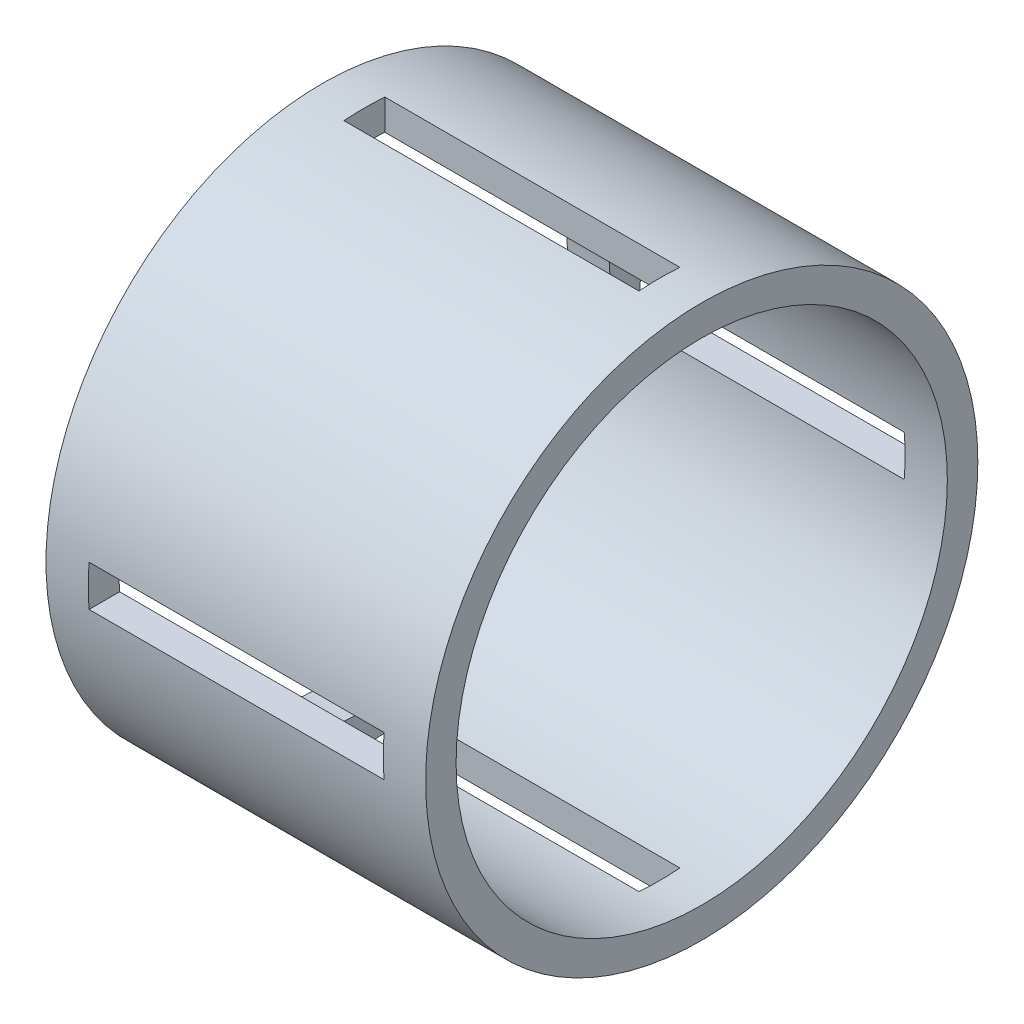
ISO-10303-21;
HEADER;
FILE_DESCRIPTION(('STEP AP214'),'2;1');
FILE_NAME('part.step','',(''),(''),'','','');
FILE_SCHEMA(('AUTOMOTIVE_DESIGN { 1 0 10303 214 1 1 1 1 }'));
ENDSEC;
DATA;
#1=APPLICATION_CONTEXT('core data for automotive mechanical design processes');
#2=APPLICATION_PROTOCOL_DEFINITION('international standard','automotive_design',2000,#1);
#3=PRODUCT_CONTEXT('',#1,'mechanical');
#4=PRODUCT('Part','Part','',(#3));
#5=PRODUCT_RELATED_PRODUCT_CATEGORY('part','',(#4));
#6=PRODUCT_DEFINITION_FORMATION('','',#4);
#7=PRODUCT_DEFINITION_CONTEXT('part definition',#1,'design');
#8=PRODUCT_DEFINITION('design','',#6,#7);
#9=PRODUCT_DEFINITION_SHAPE('','',#8);
#10=(LENGTH_UNIT() NAMED_UNIT(*) SI_UNIT(.MILLI.,.METRE.));
#11=(NAMED_UNIT(*) PLANE_ANGLE_UNIT() SI_UNIT($,.RADIAN.));
#12=(NAMED_UNIT(*) SI_UNIT($,.STERADIAN.) SOLID_ANGLE_UNIT());
#13=UNCERTAINTY_MEASURE_WITH_UNIT(LENGTH_MEASURE(1.E-05),#10,'distance_accuracy_value','');
#14=(GEOMETRIC_REPRESENTATION_CONTEXT(3) GLOBAL_UNCERTAINTY_ASSIGNED_CONTEXT((#13)) GLOBAL_UNIT_ASSIGNED_CONTEXT((#10,
#11,#12)) REPRESENTATION_CONTEXT('',''));
#15=CARTESIAN_POINT('',(0.,0.,0.));
#16=DIRECTION('',(0.,0.,1.));
#17=DIRECTION('',(1.,0.,0.));
#18=AXIS2_PLACEMENT_3D('',#15,#16,#17);
#19=CARTESIAN_POINT('',(6.5,0.68,8.68));
#20=DIRECTION('',(0.,-1.,0.));
#21=DIRECTION('',(1.,0.,0.));
#22=AXIS2_PLACEMENT_3D('',#19,#20,#21);
#23=PLANE('',#22);
#24=DIRECTION('',(1.,0.,0.));
#25=VECTOR('',#24,1.);
#26=CARTESIAN_POINT('',(6.5,0.68,8.13161730530895));
#27=LINE('',#26,#25);
#28=CARTESIAN_POINT('',(11.4,0.68,8.13161730530895));
#29=VERTEX_POINT('',#28);
#30=CARTESIAN_POINT('',(1.6,0.68,8.13161730530895));
#31=VERTEX_POINT('',#30);
#32=EDGE_CURVE('E154',#29,#31,#27,.F.);
#33=ORIENTED_EDGE('',*,*,#32,.F.);
#34=DIRECTION('',(0.,0.,1.));
#35=VECTOR('',#34,1.);
#36=CARTESIAN_POINT('',(11.4,0.68,8.68));
#37=LINE('',#36,#35);
#38=CARTESIAN_POINT('',(11.4,0.68,9.147560321747));
#39=VERTEX_POINT('',#38);
#40=EDGE_CURVE('E237',#29,#39,#37,.T.);
#41=ORIENTED_EDGE('',*,*,#40,.T.);
#42=DIRECTION('',(1.,0.,0.));
#43=VECTOR('',#42,1.);
#44=CARTESIAN_POINT('',(6.5,0.680000000000001,9.147560321747));
#45=LINE('',#44,#43);
#46=CARTESIAN_POINT('',(1.6,0.680000000000001,9.147560321747));
#47=VERTEX_POINT('',#46);
#48=EDGE_CURVE('E219',#47,#39,#45,.T.);
#49=ORIENTED_EDGE('',*,*,#48,.F.);
#50=DIRECTION('',(0.,0.,1.));
#51=VECTOR('',#50,1.);
#52=CARTESIAN_POINT('',(1.6,0.680000000000001,8.68));
#53=LINE('',#52,#51);
#54=EDGE_CURVE('E242',#47,#31,#53,.F.);
#55=ORIENTED_EDGE('',*,*,#54,.T.);
#56=EDGE_LOOP('',(#33,#41,#49,#55));
#57=FACE_BOUND('',#56,.T.);
#58=ADVANCED_FACE('F16',(#57),#23,.T.);
#59=CARTESIAN_POINT('',(6.5,0.68,-8.68));
#60=DIRECTION('',(0.,-1.,0.));
#61=DIRECTION('',(0.,0.,-1.));
#62=AXIS2_PLACEMENT_3D('',#59,#60,#61);
#63=PLANE('',#62);
#64=DIRECTION('',(1.,0.,0.));
#65=VECTOR('',#64,1.);
#66=CARTESIAN_POINT('',(6.5,0.680000000000001,-8.13161730530895));
#67=LINE('',#66,#65);
#68=CARTESIAN_POINT('',(1.6,0.68,-8.13161730530895));
#69=VERTEX_POINT('',#68);
#70=CARTESIAN_POINT('',(11.4,0.68,-8.13161730530895));
#71=VERTEX_POINT('',#70);
#72=EDGE_CURVE('E151',#69,#71,#67,.T.);
#73=ORIENTED_EDGE('',*,*,#72,.F.);
#74=DIRECTION('',(0.,0.,-1.));
#75=VECTOR('',#74,1.);
#76=CARTESIAN_POINT('',(1.6,0.68,-8.68));
#77=LINE('',#76,#75);
#78=CARTESIAN_POINT('',(1.6,0.68,-9.147560321747));
#79=VERTEX_POINT('',#78);
#80=EDGE_CURVE('E232',#69,#79,#77,.T.);
#81=ORIENTED_EDGE('',*,*,#80,.T.);
#82=DIRECTION('',(1.,0.,0.));
#83=VECTOR('',#82,1.);
#84=CARTESIAN_POINT('',(6.5,0.68,-9.147560321747));
#85=LINE('',#84,#83);
#86=CARTESIAN_POINT('',(11.4,0.68,-9.147560321747));
#87=VERTEX_POINT('',#86);
#88=EDGE_CURVE('E214',#87,#79,#85,.F.);
#89=ORIENTED_EDGE('',*,*,#88,.F.);
#90=DIRECTION('',(0.,0.,-1.));
#91=VECTOR('',#90,1.);
#92=CARTESIAN_POINT('',(11.4,0.68,-8.68));
#93=LINE('',#92,#91);
#94=EDGE_CURVE('E234',#87,#71,#93,.F.);
#95=ORIENTED_EDGE('',*,*,#94,.T.);
#96=EDGE_LOOP('',(#73,#81,#89,#95));
#97=FACE_BOUND('',#96,.T.);
#98=ADVANCED_FACE('F297',(#97),#63,.T.);
#99=CARTESIAN_POINT('',(1.6,8.68,0.));
#100=DIRECTION('',(1.,0.,0.));
#101=DIRECTION('',(0.,1.,0.));
#102=AXIS2_PLACEMENT_3D('',#99,#100,#101);
#103=PLANE('',#102);
#104=CARTESIAN_POINT('',(1.6,0.,0.));
#105=DIRECTION('',(1.,0.,0.));
#106=DIRECTION('',(0.,0.,-1.));
#107=AXIS2_PLACEMENT_3D('',#104,#105,#106);
#108=CIRCLE('',#107,8.16);
#109=CARTESIAN_POINT('',(1.6,8.13161730530895,-0.68));
#110=VERTEX_POINT('',#109);
#111=CARTESIAN_POINT('',(1.6,8.13161730530895,0.68));
#112=VERTEX_POINT('',#111);
#113=EDGE_CURVE('E19',#110,#112,#108,.T.);
#114=ORIENTED_EDGE('',*,*,#113,.F.);
#115=DIRECTION('',(0.,-1.,0.));
#116=VECTOR('',#115,1.);
#117=CARTESIAN_POINT('',(1.6,8.68,-0.68));
#118=LINE('',#117,#116);
#119=CARTESIAN_POINT('',(1.6,9.147560321747,-0.68));
#120=VERTEX_POINT('',#119);
#121=EDGE_CURVE('E228',#120,#110,#118,.T.);
#122=ORIENTED_EDGE('',*,*,#121,.F.);
#123=CARTESIAN_POINT('',(1.6,0.,0.));
#124=DIRECTION('',(1.,0.,0.));
#125=DIRECTION('',(0.,0.,-1.));
#126=AXIS2_PLACEMENT_3D('',#123,#124,#125);
#127=CIRCLE('',#126,9.1728);
#128=CARTESIAN_POINT('',(1.6,9.147560321747,0.68));
#129=VERTEX_POINT('',#128);
#130=EDGE_CURVE('E132',#129,#120,#127,.F.);
#131=ORIENTED_EDGE('',*,*,#130,.F.);
#132=DIRECTION('',(0.,1.,0.));
#133=VECTOR('',#132,1.);
#134=CARTESIAN_POINT('',(1.6,8.68,0.68));
#135=LINE('',#134,#133);
#136=EDGE_CURVE('E128',#112,#129,#135,.T.);
#137=ORIENTED_EDGE('',*,*,#136,.F.);
#138=EDGE_LOOP('',(#114,#122,#131,#137));
#139=FACE_BOUND('',#138,.T.);
#140=ADVANCED_FACE('F130',(#139),#103,.T.);
#141=CARTESIAN_POINT('',(6.5,8.68,-0.68));
#142=DIRECTION('',(0.,0.,1.));
#143=DIRECTION('',(0.,-1.,0.));
#144=AXIS2_PLACEMENT_3D('',#141,#142,#143);
#145=PLANE('',#144);
#146=DIRECTION('',(1.,0.,0.));
#147=VECTOR('',#146,1.);
#148=CARTESIAN_POINT('',(6.5,8.13161730530895,-0.68));
#149=LINE('',#148,#147);
#150=CARTESIAN_POINT('',(11.4,8.13161730530895,-0.68));
#151=VERTEX_POINT('',#150);
#152=EDGE_CURVE('E149',#151,#110,#149,.F.);
#153=ORIENTED_EDGE('',*,*,#152,.F.);
#154=DIRECTION('',(0.,1.,0.));
#155=VECTOR('',#154,1.);
#156=CARTESIAN_POINT('',(11.4,8.68,-0.68));
#157=LINE('',#156,#155);
#158=CARTESIAN_POINT('',(11.4,9.147560321747,-0.68));
#159=VERTEX_POINT('',#158);
#160=EDGE_CURVE('E227',#151,#159,#157,.T.);
#161=ORIENTED_EDGE('',*,*,#160,.T.);
#162=DIRECTION('',(1.,0.,0.));
#163=VECTOR('',#162,1.);
#164=CARTESIAN_POINT('',(6.5,9.147560321747,-0.68));
#165=LINE('',#164,#163);
#166=EDGE_CURVE('E213',#120,#159,#165,.T.);
#167=ORIENTED_EDGE('',*,*,#166,.F.);
#168=ORIENTED_EDGE('',*,*,#121,.T.);
#169=EDGE_LOOP('',(#153,#161,#167,#168));
#170=FACE_BOUND('',#169,.T.);
#171=ADVANCED_FACE('F320',(#170),#145,.T.);
#172=CARTESIAN_POINT('',(11.4,8.68,0.));
#173=DIRECTION('',(1.,0.,0.));
#174=DIRECTION('',(0.,1.,0.));
#175=AXIS2_PLACEMENT_3D('',#172,#173,#174);
#176=PLANE('',#175);
#177=ORIENTED_EDGE('',*,*,#160,.F.);
#178=CARTESIAN_POINT('',(11.4,0.,0.));
#179=DIRECTION('',(1.,0.,0.));
#180=DIRECTION('',(0.,0.,-1.));
#181=AXIS2_PLACEMENT_3D('',#178,#179,#180);
#182=CIRCLE('',#181,8.16);
#183=CARTESIAN_POINT('',(11.4,8.13161730530895,0.68));
#184=VERTEX_POINT('',#183);
#185=EDGE_CURVE('E144',#184,#151,#182,.F.);
#186=ORIENTED_EDGE('',*,*,#185,.F.);
#187=DIRECTION('',(0.,1.,0.));
#188=VECTOR('',#187,1.);
#189=CARTESIAN_POINT('',(11.4,8.68,0.68));
#190=LINE('',#189,#188);
#191=CARTESIAN_POINT('',(11.4,9.147560321747,0.680000000000001));
#192=VERTEX_POINT('',#191);
#193=EDGE_CURVE('E136',#192,#184,#190,.F.);
#194=ORIENTED_EDGE('',*,*,#193,.F.);
#195=CARTESIAN_POINT('',(11.4,0.,0.));
#196=DIRECTION('',(1.,0.,0.));
#197=DIRECTION('',(0.,0.,-1.));
#198=AXIS2_PLACEMENT_3D('',#195,#196,#197);
#199=CIRCLE('',#198,9.1728);
#200=EDGE_CURVE('E210',#159,#192,#199,.T.);
#201=ORIENTED_EDGE('',*,*,#200,.F.);
#202=EDGE_LOOP('',(#177,#186,#194,#201));
#203=FACE_BOUND('',#202,.T.);
#204=ADVANCED_FACE('F319',(#203),#176,.F.);
#205=CARTESIAN_POINT('',(6.5,8.68,0.68));
#206=DIRECTION('',(0.,0.,-1.));
#207=DIRECTION('',(-1.,0.,0.));
#208=AXIS2_PLACEMENT_3D('',#205,#206,#207);
#209=PLANE('',#208);
#210=DIRECTION('',(1.,0.,0.));
#211=VECTOR('',#210,1.);
#212=CARTESIAN_POINT('',(6.5,8.13161730530895,0.68));
#213=LINE('',#212,#211);
#214=EDGE_CURVE('E139',#112,#184,#213,.T.);
#215=ORIENTED_EDGE('',*,*,#214,.F.);
#216=ORIENTED_EDGE('',*,*,#136,.T.);
#217=DIRECTION('',(1.,0.,0.));
#218=VECTOR('',#217,1.);
#219=CARTESIAN_POINT('',(6.5,9.147560321747,0.680000000000001));
#220=LINE('',#219,#218);
#221=EDGE_CURVE('E209',#192,#129,#220,.F.);
#222=ORIENTED_EDGE('',*,*,#221,.F.);
#223=ORIENTED_EDGE('',*,*,#193,.T.);
#224=EDGE_LOOP('',(#215,#216,#222,#223));
#225=FACE_BOUND('',#224,.T.);
#226=ADVANCED_FACE('F140',(#225),#209,.T.);
#227=CARTESIAN_POINT('',(0.195000000000001,0.,0.));
#228=DIRECTION('',(1.,0.,0.));
#229=DIRECTION('',(0.,0.,-1.));
#230=AXIS2_PLACEMENT_3D('',#227,#228,#229);
#231=CYLINDRICAL_SURFACE('',#230,8.16);
#232=ORIENTED_EDGE('',*,*,#32,.T.);
#233=CARTESIAN_POINT('',(1.6,0.,0.));
#234=DIRECTION('',(1.,0.,0.));
#235=DIRECTION('',(0.,0.,-1.));
#236=AXIS2_PLACEMENT_3D('',#233,#234,#235);
#237=CIRCLE('',#236,8.16);
#238=CARTESIAN_POINT('',(1.6,-0.679999999999999,8.13161730530895));
#239=VERTEX_POINT('',#238);
#240=EDGE_CURVE('E190',#239,#31,#237,.F.);
#241=ORIENTED_EDGE('',*,*,#240,.F.);
#242=DIRECTION('',(1.,0.,0.));
#243=VECTOR('',#242,1.);
#244=CARTESIAN_POINT('',(6.5,-0.68,8.13161730530895));
#245=LINE('',#244,#243);
#246=CARTESIAN_POINT('',(11.4,-0.68,8.13161730530895));
#247=VERTEX_POINT('',#246);
#248=EDGE_CURVE('E261',#247,#239,#245,.F.);
#249=ORIENTED_EDGE('',*,*,#248,.F.);
#250=CARTESIAN_POINT('',(11.4,0.,0.));
#251=DIRECTION('',(1.,0.,0.));
#252=DIRECTION('',(0.,0.,-1.));
#253=AXIS2_PLACEMENT_3D('',#250,#251,#252);
#254=CIRCLE('',#253,8.16);
#255=EDGE_CURVE('E193',#247,#29,#254,.F.);
#256=ORIENTED_EDGE('',*,*,#255,.T.);
#257=EDGE_LOOP('',(#232,#241,#249,#256));
#258=FACE_BOUND('',#257,.T.);
#259=CARTESIAN_POINT('',(12.805,0.,0.));
#260=DIRECTION('',(1.,0.,0.));
#261=DIRECTION('',(0.,0.,-1.));
#262=AXIS2_PLACEMENT_3D('',#259,#260,#261);
#263=CIRCLE('',#262,8.16);
#264=CARTESIAN_POINT('',(12.805,0.,-8.16));
#265=VERTEX_POINT('',#264);
#266=EDGE_CURVE('E196',#265,#265,#263,.F.);
#267=ORIENTED_EDGE('',*,*,#266,.F.);
#268=EDGE_LOOP('',(#267));
#269=FACE_BOUND('',#268,.T.);
#270=ORIENTED_EDGE('',*,*,#72,.T.);
#271=CARTESIAN_POINT('',(11.4,0.,0.));
#272=DIRECTION('',(1.,0.,0.));
#273=DIRECTION('',(0.,0.,-1.));
#274=AXIS2_PLACEMENT_3D('',#271,#272,#273);
#275=CIRCLE('',#274,8.16);
#276=CARTESIAN_POINT('',(11.4,-0.68,-8.13161730530895));
#277=VERTEX_POINT('',#276);
#278=EDGE_CURVE('E200',#71,#277,#275,.F.);
#279=ORIENTED_EDGE('',*,*,#278,.T.);
#280=DIRECTION('',(1.,0.,0.));
#281=VECTOR('',#280,1.);
#282=CARTESIAN_POINT('',(6.5,-0.68,-8.13161730530895));
#283=LINE('',#282,#281);
#284=CARTESIAN_POINT('',(1.6,-0.68,-8.13161730530895));
#285=VERTEX_POINT('',#284);
#286=EDGE_CURVE('E202',#285,#277,#283,.T.);
#287=ORIENTED_EDGE('',*,*,#286,.F.);
#288=CARTESIAN_POINT('',(1.6,0.,0.));
#289=DIRECTION('',(1.,0.,0.));
#290=DIRECTION('',(0.,0.,-1.));
#291=AXIS2_PLACEMENT_3D('',#288,#289,#290);
#292=CIRCLE('',#291,8.16);
#293=EDGE_CURVE('E203',#69,#285,#292,.F.);
#294=ORIENTED_EDGE('',*,*,#293,.F.);
#295=EDGE_LOOP('',(#270,#279,#287,#294));
#296=FACE_BOUND('',#295,.T.);
#297=CARTESIAN_POINT('',(11.4,0.,0.));
#298=DIRECTION('',(1.,0.,0.));
#299=DIRECTION('',(0.,0.,-1.));
#300=AXIS2_PLACEMENT_3D('',#297,#298,#299);
#301=CIRCLE('',#300,8.16);
#302=CARTESIAN_POINT('',(11.4,-8.13161730530895,-0.679999999999999));
#303=VERTEX_POINT('',#302);
#304=CARTESIAN_POINT('',(11.4,-8.13161730530895,0.68));
#305=VERTEX_POINT('',#304);
#306=EDGE_CURVE('E183',#303,#305,#301,.F.);
#307=ORIENTED_EDGE('',*,*,#306,.T.);
#308=DIRECTION('',(-1.,0.,0.));
#309=VECTOR('',#308,1.);
#310=CARTESIAN_POINT('',(6.5,-8.13161730530895,0.680000000000001));
#311=LINE('',#310,#309);
#312=CARTESIAN_POINT('',(1.6,-8.13161730530895,0.680000000000002));
#313=VERTEX_POINT('',#312);
#314=EDGE_CURVE('E186',#313,#305,#311,.F.);
#315=ORIENTED_EDGE('',*,*,#314,.F.);
#316=CARTESIAN_POINT('',(1.6,0.,0.));
#317=DIRECTION('',(1.,0.,0.));
#318=DIRECTION('',(0.,0.,-1.));
#319=AXIS2_PLACEMENT_3D('',#316,#317,#318);
#320=CIRCLE('',#319,8.16);
#321=CARTESIAN_POINT('',(1.6,-8.13161730530895,-0.679999999999999));
#322=VERTEX_POINT('',#321);
#323=EDGE_CURVE('E187',#322,#313,#320,.F.);
#324=ORIENTED_EDGE('',*,*,#323,.F.);
#325=DIRECTION('',(1.,0.,0.));
#326=VECTOR('',#325,1.);
#327=CARTESIAN_POINT('',(6.5,-8.13161730530895,-0.679999999999999));
#328=LINE('',#327,#326);
#329=EDGE_CURVE('E275',#303,#322,#328,.F.);
#330=ORIENTED_EDGE('',*,*,#329,.F.);
#331=EDGE_LOOP('',(#307,#315,#324,#330));
#332=FACE_BOUND('',#331,.T.);
#333=CARTESIAN_POINT('',(0.195000000000001,0.,0.));
#334=DIRECTION('',(1.,0.,0.));
#335=DIRECTION('',(0.,0.,-1.));
#336=AXIS2_PLACEMENT_3D('',#333,#334,#335);
#337=CIRCLE('',#336,8.16);
#338=CARTESIAN_POINT('',(0.195000000000001,0.,-8.16));
#339=VERTEX_POINT('',#338);
#340=EDGE_CURVE('E206',#339,#339,#337,.T.);
#341=ORIENTED_EDGE('',*,*,#340,.F.);
#342=EDGE_LOOP('',(#341));
#343=FACE_BOUND('',#342,.T.);
#344=ORIENTED_EDGE('',*,*,#185,.T.);
#345=ORIENTED_EDGE('',*,*,#152,.T.);
#346=ORIENTED_EDGE('',*,*,#113,.T.);
#347=ORIENTED_EDGE('',*,*,#214,.T.);
#348=EDGE_LOOP('',(#344,#345,#346,#347));
#349=FACE_BOUND('',#348,.T.);
#350=ADVANCED_FACE('F147',(#258,#269,#296,#332,#343,#349),#231,.F.);
#351=CARTESIAN_POINT('',(0.195,0.,8.6664));
#352=DIRECTION('',(-1.,0.,0.));
#353=DIRECTION('',(0.,0.,1.));
#354=AXIS2_PLACEMENT_3D('',#351,#352,#353);
#355=PLANE('',#354);
#356=ORIENTED_EDGE('',*,*,#340,.T.);
#357=EDGE_LOOP('',(#356));
#358=FACE_BOUND('',#357,.T.);
#359=CARTESIAN_POINT('',(0.195000000000001,0.,0.));
#360=DIRECTION('',(1.,0.,0.));
#361=DIRECTION('',(0.,0.,-1.));
#362=AXIS2_PLACEMENT_3D('',#359,#360,#361);
#363=CIRCLE('',#362,9.1728);
#364=CARTESIAN_POINT('',(0.195000000000001,0.,-9.1728));
#365=VERTEX_POINT('',#364);
#366=EDGE_CURVE('E179',#365,#365,#363,.T.);
#367=ORIENTED_EDGE('',*,*,#366,.F.);
#368=EDGE_LOOP('',(#367));
#369=FACE_BOUND('',#368,.T.);
#370=ADVANCED_FACE('F300',(#358,#369),#355,.T.);
#371=CARTESIAN_POINT('',(1.6,0.,-8.68));
#372=DIRECTION('',(1.,0.,0.));
#373=DIRECTION('',(0.,1.,0.));
#374=AXIS2_PLACEMENT_3D('',#371,#372,#373);
#375=PLANE('',#374);
#376=DIRECTION('',(0.,0.,1.));
#377=VECTOR('',#376,1.);
#378=CARTESIAN_POINT('',(1.6,-0.68,-8.68));
#379=LINE('',#378,#377);
#380=CARTESIAN_POINT('',(1.6,-0.680000000000001,-9.147560321747));
#381=VERTEX_POINT('',#380);
#382=EDGE_CURVE('E205',#381,#285,#379,.T.);
#383=ORIENTED_EDGE('',*,*,#382,.F.);
#384=CARTESIAN_POINT('',(1.6,0.,0.));
#385=DIRECTION('',(1.,0.,0.));
#386=DIRECTION('',(0.,0.,-1.));
#387=AXIS2_PLACEMENT_3D('',#384,#385,#386);
#388=CIRCLE('',#387,9.1728);
#389=EDGE_CURVE('E176',#79,#381,#388,.F.);
#390=ORIENTED_EDGE('',*,*,#389,.F.);
#391=ORIENTED_EDGE('',*,*,#80,.F.);
#392=ORIENTED_EDGE('',*,*,#293,.T.);
#393=EDGE_LOOP('',(#383,#390,#391,#392));
#394=FACE_BOUND('',#393,.T.);
#395=ADVANCED_FACE('F294',(#394),#375,.T.);
#396=CARTESIAN_POINT('',(6.5,-0.68,-8.68));
#397=DIRECTION('',(0.,1.,0.));
#398=DIRECTION('',(0.,0.,1.));
#399=AXIS2_PLACEMENT_3D('',#396,#397,#398);
#400=PLANE('',#399);
#401=ORIENTED_EDGE('',*,*,#286,.T.);
#402=DIRECTION('',(0.,0.,1.));
#403=VECTOR('',#402,1.);
#404=CARTESIAN_POINT('',(11.4,-0.68,-8.68));
#405=LINE('',#404,#403);
#406=CARTESIAN_POINT('',(11.4,-0.680000000000001,-9.147560321747));
#407=VERTEX_POINT('',#406);
#408=EDGE_CURVE('E199',#277,#407,#405,.F.);
#409=ORIENTED_EDGE('',*,*,#408,.T.);
#410=DIRECTION('',(1.,0.,0.));
#411=VECTOR('',#410,1.);
#412=CARTESIAN_POINT('',(6.5,-0.680000000000002,-9.147560321747));
#413=LINE('',#412,#411);
#414=EDGE_CURVE('E175',#381,#407,#413,.T.);
#415=ORIENTED_EDGE('',*,*,#414,.F.);
#416=ORIENTED_EDGE('',*,*,#382,.T.);
#417=EDGE_LOOP('',(#401,#409,#415,#416));
#418=FACE_BOUND('',#417,.T.);
#419=ADVANCED_FACE('F283',(#418),#400,.T.);
#420=CARTESIAN_POINT('',(11.4,0.,-8.68));
#421=DIRECTION('',(1.,0.,0.));
#422=DIRECTION('',(0.,1.,0.));
#423=AXIS2_PLACEMENT_3D('',#420,#421,#422);
#424=PLANE('',#423);
#425=ORIENTED_EDGE('',*,*,#408,.F.);
#426=ORIENTED_EDGE('',*,*,#278,.F.);
#427=ORIENTED_EDGE('',*,*,#94,.F.);
#428=CARTESIAN_POINT('',(11.4,0.,0.));
#429=DIRECTION('',(1.,0.,0.));
#430=DIRECTION('',(0.,0.,-1.));
#431=AXIS2_PLACEMENT_3D('',#428,#429,#430);
#432=CIRCLE('',#431,9.1728);
#433=EDGE_CURVE('E173',#407,#87,#432,.T.);
#434=ORIENTED_EDGE('',*,*,#433,.F.);
#435=EDGE_LOOP('',(#425,#426,#427,#434));
#436=FACE_BOUND('',#435,.T.);
#437=ADVANCED_FACE('F288',(#436),#424,.F.);
#438=CARTESIAN_POINT('',(12.805,0.,8.6664));
#439=DIRECTION('',(1.,0.,0.));
#440=DIRECTION('',(0.,0.,-1.));
#441=AXIS2_PLACEMENT_3D('',#438,#439,#440);
#442=PLANE('',#441);
#443=CARTESIAN_POINT('',(12.805,0.,0.));
#444=DIRECTION('',(1.,0.,0.));
#445=DIRECTION('',(0.,0.,-1.));
#446=AXIS2_PLACEMENT_3D('',#443,#444,#445);
#447=CIRCLE('',#446,9.1728);
#448=CARTESIAN_POINT('',(12.805,0.,-9.1728));
#449=VERTEX_POINT('',#448);
#450=EDGE_CURVE('E170',#449,#449,#447,.F.);
#451=ORIENTED_EDGE('',*,*,#450,.F.);
#452=EDGE_LOOP('',(#451));
#453=FACE_BOUND('',#452,.T.);
#454=ORIENTED_EDGE('',*,*,#266,.T.);
#455=EDGE_LOOP('',(#454));
#456=FACE_BOUND('',#455,.T.);
#457=ADVANCED_FACE('F358',(#453,#456),#442,.T.);
#458=CARTESIAN_POINT('',(11.4,0.,8.68));
#459=DIRECTION('',(1.,0.,0.));
#460=DIRECTION('',(0.,1.,0.));
#461=AXIS2_PLACEMENT_3D('',#458,#459,#460);
#462=PLANE('',#461);
#463=ORIENTED_EDGE('',*,*,#40,.F.);
#464=ORIENTED_EDGE('',*,*,#255,.F.);
#465=DIRECTION('',(0.,0.,1.));
#466=VECTOR('',#465,1.);
#467=CARTESIAN_POINT('',(11.4,-0.68,8.68));
#468=LINE('',#467,#466);
#469=CARTESIAN_POINT('',(11.4,-0.679999999999999,9.147560321747));
#470=VERTEX_POINT('',#469);
#471=EDGE_CURVE('E195',#470,#247,#468,.F.);
#472=ORIENTED_EDGE('',*,*,#471,.F.);
#473=CARTESIAN_POINT('',(11.4,0.,0.));
#474=DIRECTION('',(1.,0.,0.));
#475=DIRECTION('',(0.,0.,-1.));
#476=AXIS2_PLACEMENT_3D('',#473,#474,#475);
#477=CIRCLE('',#476,9.1728);
#478=EDGE_CURVE('E167',#39,#470,#477,.T.);
#479=ORIENTED_EDGE('',*,*,#478,.F.);
#480=EDGE_LOOP('',(#463,#464,#472,#479));
#481=FACE_BOUND('',#480,.T.);
#482=ADVANCED_FACE('F363',(#481),#462,.F.);
#483=CARTESIAN_POINT('',(6.5,-0.68,8.68));
#484=DIRECTION('',(0.,1.,0.));
#485=DIRECTION('',(0.,0.,1.));
#486=AXIS2_PLACEMENT_3D('',#483,#484,#485);
#487=PLANE('',#486);
#488=ORIENTED_EDGE('',*,*,#248,.T.);
#489=DIRECTION('',(0.,0.,1.));
#490=VECTOR('',#489,1.);
#491=CARTESIAN_POINT('',(1.6,-0.679999999999999,8.68));
#492=LINE('',#491,#490);
#493=CARTESIAN_POINT('',(1.6,-0.679999999999999,9.147560321747));
#494=VERTEX_POINT('',#493);
#495=EDGE_CURVE('E192',#494,#239,#492,.F.);
#496=ORIENTED_EDGE('',*,*,#495,.F.);
#497=DIRECTION('',(1.,0.,0.));
#498=VECTOR('',#497,1.);
#499=CARTESIAN_POINT('',(6.5,-0.679999999999998,9.147560321747));
#500=LINE('',#499,#498);
#501=EDGE_CURVE('E166',#470,#494,#500,.F.);
#502=ORIENTED_EDGE('',*,*,#501,.F.);
#503=ORIENTED_EDGE('',*,*,#471,.T.);
#504=EDGE_LOOP('',(#488,#496,#502,#503));
#505=FACE_BOUND('',#504,.T.);
#506=ADVANCED_FACE('F457',(#505),#487,.T.);
#507=CARTESIAN_POINT('',(1.6,0.,8.68));
#508=DIRECTION('',(1.,0.,0.));
#509=DIRECTION('',(0.,1.,0.));
#510=AXIS2_PLACEMENT_3D('',#507,#508,#509);
#511=PLANE('',#510);
#512=ORIENTED_EDGE('',*,*,#54,.F.);
#513=CARTESIAN_POINT('',(1.6,0.,0.));
#514=DIRECTION('',(1.,0.,0.));
#515=DIRECTION('',(0.,0.,-1.));
#516=AXIS2_PLACEMENT_3D('',#513,#514,#515);
#517=CIRCLE('',#516,9.1728);
#518=EDGE_CURVE('E164',#494,#47,#517,.F.);
#519=ORIENTED_EDGE('',*,*,#518,.F.);
#520=ORIENTED_EDGE('',*,*,#495,.T.);
#521=ORIENTED_EDGE('',*,*,#240,.T.);
#522=EDGE_LOOP('',(#512,#519,#520,#521));
#523=FACE_BOUND('',#522,.T.);
#524=ADVANCED_FACE('F257',(#523),#511,.T.);
#525=CARTESIAN_POINT('',(1.6,-8.68,0.));
#526=DIRECTION('',(1.,0.,0.));
#527=DIRECTION('',(0.,0.,-1.));
#528=AXIS2_PLACEMENT_3D('',#525,#526,#527);
#529=PLANE('',#528);
#530=ORIENTED_EDGE('',*,*,#323,.T.);
#531=DIRECTION('',(0.,1.,0.));
#532=VECTOR('',#531,1.);
#533=CARTESIAN_POINT('',(1.6,-8.68,0.680000000000002));
#534=LINE('',#533,#532);
#535=CARTESIAN_POINT('',(1.6,-9.147560321747,0.680000000000001));
#536=VERTEX_POINT('',#535);
#537=EDGE_CURVE('E189',#536,#313,#534,.T.);
#538=ORIENTED_EDGE('',*,*,#537,.F.);
#539=CARTESIAN_POINT('',(1.6,0.,0.));
#540=DIRECTION('',(1.,0.,0.));
#541=DIRECTION('',(0.,0.,-1.));
#542=AXIS2_PLACEMENT_3D('',#539,#540,#541);
#543=CIRCLE('',#542,9.1728);
#544=CARTESIAN_POINT('',(1.6,-9.147560321747,-0.679999999999998));
#545=VERTEX_POINT('',#544);
#546=EDGE_CURVE('E161',#545,#536,#543,.F.);
#547=ORIENTED_EDGE('',*,*,#546,.F.);
#548=DIRECTION('',(0.,1.,0.));
#549=VECTOR('',#548,1.);
#550=CARTESIAN_POINT('',(1.6,-8.68,-0.679999999999999));
#551=LINE('',#550,#549);
#552=EDGE_CURVE('E182',#322,#545,#551,.F.);
#553=ORIENTED_EDGE('',*,*,#552,.F.);
#554=EDGE_LOOP('',(#530,#538,#547,#553));
#555=FACE_BOUND('',#554,.T.);
#556=ADVANCED_FACE('F475',(#555),#529,.T.);
#557=CARTESIAN_POINT('',(6.5,-8.68,0.680000000000001));
#558=DIRECTION('',(0.,0.,-1.));
#559=DIRECTION('',(-1.,0.,0.));
#560=AXIS2_PLACEMENT_3D('',#557,#558,#559);
#561=PLANE('',#560);
#562=ORIENTED_EDGE('',*,*,#314,.T.);
#563=DIRECTION('',(0.,1.,0.));
#564=VECTOR('',#563,1.);
#565=CARTESIAN_POINT('',(11.4,-8.68,0.68));
#566=LINE('',#565,#564);
#567=CARTESIAN_POINT('',(11.4,-9.147560321747,0.68));
#568=VERTEX_POINT('',#567);
#569=EDGE_CURVE('E185',#305,#568,#566,.F.);
#570=ORIENTED_EDGE('',*,*,#569,.T.);
#571=DIRECTION('',(1.,0.,0.));
#572=VECTOR('',#571,1.);
#573=CARTESIAN_POINT('',(6.5,-9.147560321747,0.680000000000001));
#574=LINE('',#573,#572);
#575=EDGE_CURVE('E160',#536,#568,#574,.T.);
#576=ORIENTED_EDGE('',*,*,#575,.F.);
#577=ORIENTED_EDGE('',*,*,#537,.T.);
#578=EDGE_LOOP('',(#562,#570,#576,#577));
#579=FACE_BOUND('',#578,.T.);
#580=ADVANCED_FACE('F484',(#579),#561,.T.);
#581=CARTESIAN_POINT('',(11.4,-8.68,0.));
#582=DIRECTION('',(1.,0.,0.));
#583=DIRECTION('',(0.,0.,-1.));
#584=AXIS2_PLACEMENT_3D('',#581,#582,#583);
#585=PLANE('',#584);
#586=ORIENTED_EDGE('',*,*,#569,.F.);
#587=ORIENTED_EDGE('',*,*,#306,.F.);
#588=DIRECTION('',(0.,1.,0.));
#589=VECTOR('',#588,1.);
#590=CARTESIAN_POINT('',(11.4,-8.68,-0.679999999999999));
#591=LINE('',#590,#589);
#592=CARTESIAN_POINT('',(11.4,-9.147560321747,-0.679999999999998));
#593=VERTEX_POINT('',#592);
#594=EDGE_CURVE('E34',#593,#303,#591,.T.);
#595=ORIENTED_EDGE('',*,*,#594,.F.);
#596=CARTESIAN_POINT('',(11.4,0.,0.));
#597=DIRECTION('',(1.,0.,0.));
#598=DIRECTION('',(0.,0.,-1.));
#599=AXIS2_PLACEMENT_3D('',#596,#597,#598);
#600=CIRCLE('',#599,9.1728);
#601=EDGE_CURVE('E25',#568,#593,#600,.T.);
#602=ORIENTED_EDGE('',*,*,#601,.F.);
#603=EDGE_LOOP('',(#586,#587,#595,#602));
#604=FACE_BOUND('',#603,.T.);
#605=ADVANCED_FACE('F494',(#604),#585,.F.);
#606=CARTESIAN_POINT('',(6.5,-8.68,-0.679999999999999));
#607=DIRECTION('',(0.,0.,1.));
#608=DIRECTION('',(1.,0.,0.));
#609=AXIS2_PLACEMENT_3D('',#606,#607,#608);
#610=PLANE('',#609);
#611=ORIENTED_EDGE('',*,*,#329,.T.);
#612=ORIENTED_EDGE('',*,*,#552,.T.);
#613=DIRECTION('',(1.,0.,0.));
#614=VECTOR('',#613,1.);
#615=CARTESIAN_POINT('',(6.5,-9.147560321747,-0.679999999999998));
#616=LINE('',#615,#614);
#617=EDGE_CURVE('E11',#593,#545,#616,.F.);
#618=ORIENTED_EDGE('',*,*,#617,.F.);
#619=ORIENTED_EDGE('',*,*,#594,.T.);
#620=EDGE_LOOP('',(#611,#612,#618,#619));
#621=FACE_BOUND('',#620,.T.);
#622=ADVANCED_FACE('F313',(#621),#610,.T.);
#623=CARTESIAN_POINT('',(6.5,0.,0.));
#624=DIRECTION('',(1.,0.,0.));
#625=DIRECTION('',(0.,0.,-1.));
#626=AXIS2_PLACEMENT_3D('',#623,#624,#625);
#627=CYLINDRICAL_SURFACE('',#626,9.1728);
#628=ORIENTED_EDGE('',*,*,#518,.T.);
#629=ORIENTED_EDGE('',*,*,#48,.T.);
#630=ORIENTED_EDGE('',*,*,#478,.T.);
#631=ORIENTED_EDGE('',*,*,#501,.T.);
#632=EDGE_LOOP('',(#628,#629,#630,#631));
#633=FACE_BOUND('',#632,.T.);
#634=ORIENTED_EDGE('',*,*,#450,.T.);
#635=EDGE_LOOP('',(#634));
#636=FACE_BOUND('',#635,.T.);
#637=ORIENTED_EDGE('',*,*,#433,.T.);
#638=ORIENTED_EDGE('',*,*,#88,.T.);
#639=ORIENTED_EDGE('',*,*,#389,.T.);
#640=ORIENTED_EDGE('',*,*,#414,.T.);
#641=EDGE_LOOP('',(#637,#638,#639,#640));
#642=FACE_BOUND('',#641,.T.);
#643=ORIENTED_EDGE('',*,*,#601,.T.);
#644=ORIENTED_EDGE('',*,*,#617,.T.);
#645=ORIENTED_EDGE('',*,*,#546,.T.);
#646=ORIENTED_EDGE('',*,*,#575,.T.);
#647=EDGE_LOOP('',(#643,#644,#645,#646));
#648=FACE_BOUND('',#647,.T.);
#649=ORIENTED_EDGE('',*,*,#366,.T.);
#650=EDGE_LOOP('',(#649));
#651=FACE_BOUND('',#650,.T.);
#652=ORIENTED_EDGE('',*,*,#200,.T.);
#653=ORIENTED_EDGE('',*,*,#221,.T.);
#654=ORIENTED_EDGE('',*,*,#130,.T.);
#655=ORIENTED_EDGE('',*,*,#166,.T.);
#656=EDGE_LOOP('',(#652,#653,#654,#655));
#657=FACE_BOUND('',#656,.T.);
#658=ADVANCED_FACE('F290',(#633,#636,#642,#648,#651,#657),#627,.T.);
#659=CLOSED_SHELL('',(#58,#98,#140,#171,#204,#226,#350,#370,#395,#419,#437,#457,#482,#506,#524,
#556,#580,#605,#622,#658));
#660=MANIFOLD_SOLID_BREP('B1',#659);
#661=ADVANCED_BREP_SHAPE_REPRESENTATION('',(#18,#660),#14);
#662=SHAPE_DEFINITION_REPRESENTATION(#9,#661);
ENDSEC;
END-ISO-10303-21;
